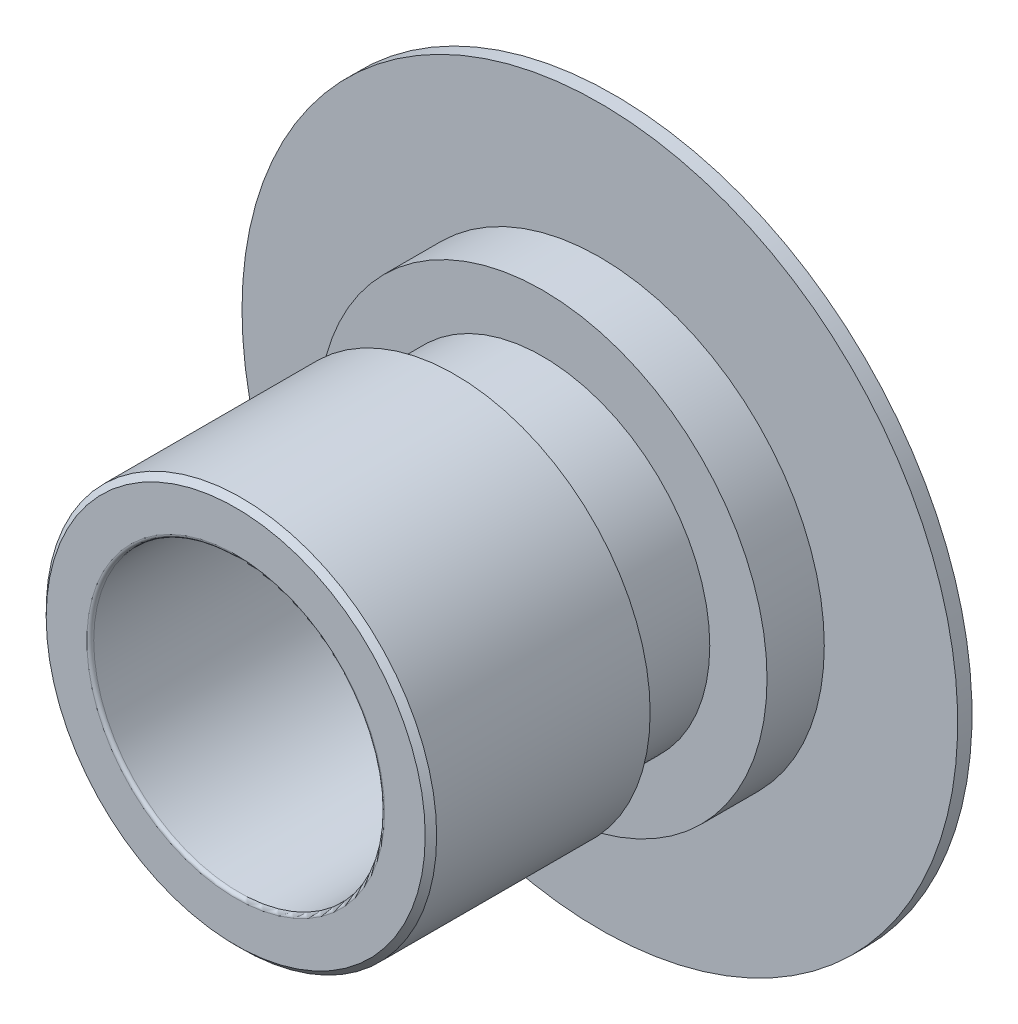
ISO-10303-21;
HEADER;
FILE_DESCRIPTION(('STEP AP214'),'2;1');
FILE_NAME('part.step','',(''),(''),'','','');
FILE_SCHEMA(('AUTOMOTIVE_DESIGN { 1 0 10303 214 1 1 1 1 }'));
ENDSEC;
DATA;
#1=APPLICATION_CONTEXT('core data for automotive mechanical design processes');
#2=APPLICATION_PROTOCOL_DEFINITION('international standard','automotive_design',2000,#1);
#3=PRODUCT_CONTEXT('',#1,'mechanical');
#4=PRODUCT('Part','Part','',(#3));
#5=PRODUCT_RELATED_PRODUCT_CATEGORY('part','',(#4));
#6=PRODUCT_DEFINITION_FORMATION('','',#4);
#7=PRODUCT_DEFINITION_CONTEXT('part definition',#1,'design');
#8=PRODUCT_DEFINITION('design','',#6,#7);
#9=PRODUCT_DEFINITION_SHAPE('','',#8);
#10=(LENGTH_UNIT() NAMED_UNIT(*) SI_UNIT(.MILLI.,.METRE.));
#11=(NAMED_UNIT(*) PLANE_ANGLE_UNIT() SI_UNIT($,.RADIAN.));
#12=(NAMED_UNIT(*) SI_UNIT($,.STERADIAN.) SOLID_ANGLE_UNIT());
#13=UNCERTAINTY_MEASURE_WITH_UNIT(LENGTH_MEASURE(1.E-05),#10,'distance_accuracy_value','');
#14=(GEOMETRIC_REPRESENTATION_CONTEXT(3) GLOBAL_UNCERTAINTY_ASSIGNED_CONTEXT((#13)) GLOBAL_UNIT_ASSIGNED_CONTEXT((#10,
#11,#12)) REPRESENTATION_CONTEXT('',''));
#15=CARTESIAN_POINT('',(0.,0.,0.));
#16=DIRECTION('',(0.,0.,1.));
#17=DIRECTION('',(1.,0.,0.));
#18=AXIS2_PLACEMENT_3D('',#15,#16,#17);
#19=CARTESIAN_POINT('',(0.,0.,6.8072));
#20=DIRECTION('',(0.,0.,1.));
#21=DIRECTION('',(1.,0.,0.));
#22=AXIS2_PLACEMENT_3D('',#19,#20,#21);
#23=PLANE('',#22);
#24=CARTESIAN_POINT('',(0.,0.,6.8072));
#25=DIRECTION('',(0.,0.,1.));
#26=DIRECTION('',(1.,0.,0.));
#27=AXIS2_PLACEMENT_3D('',#24,#25,#26);
#28=CIRCLE('',#27,3.302);
#29=CARTESIAN_POINT('',(3.302,0.,6.8072));
#30=VERTEX_POINT('',#29);
#31=EDGE_CURVE('E10',#30,#30,#28,.F.);
#32=ORIENTED_EDGE('',*,*,#31,.T.);
#33=EDGE_LOOP('',(#32));
#34=FACE_BOUND('',#33,.T.);
#35=CARTESIAN_POINT('',(0.,0.,6.8072));
#36=DIRECTION('',(0.,0.,1.));
#37=DIRECTION('',(1.,0.,0.));
#38=AXIS2_PLACEMENT_3D('',#35,#36,#37);
#39=CIRCLE('',#38,4.2037);
#40=CARTESIAN_POINT('',(4.2037,0.,6.8072));
#41=VERTEX_POINT('',#40);
#42=EDGE_CURVE('E46',#41,#41,#39,.T.);
#43=ORIENTED_EDGE('',*,*,#42,.T.);
#44=EDGE_LOOP('',(#43));
#45=FACE_BOUND('',#44,.T.);
#46=ADVANCED_FACE('F31',(#34,#45),#23,.T.);
#47=CARTESIAN_POINT('',(0.,0.,6.8072));
#48=DIRECTION('',(0.,0.,-1.));
#49=DIRECTION('',(-1.,0.,0.));
#50=AXIS2_PLACEMENT_3D('',#47,#48,#49);
#51=CYLINDRICAL_SURFACE('',#50,4.3307);
#52=CARTESIAN_POINT('',(0.,0.,6.6802));
#53=DIRECTION('',(0.,0.,1.));
#54=DIRECTION('',(1.,0.,0.));
#55=AXIS2_PLACEMENT_3D('',#52,#53,#54);
#56=CIRCLE('',#55,4.3307);
#57=CARTESIAN_POINT('',(4.3307,0.,6.6802));
#58=VERTEX_POINT('',#57);
#59=EDGE_CURVE('E42',#58,#58,#56,.F.);
#60=ORIENTED_EDGE('',*,*,#59,.T.);
#61=EDGE_LOOP('',(#60));
#62=FACE_BOUND('',#61,.T.);
#63=CARTESIAN_POINT('',(0.,0.,1.94474478244989));
#64=DIRECTION('',(0.,0.,1.));
#65=DIRECTION('',(1.,0.,0.));
#66=AXIS2_PLACEMENT_3D('',#63,#64,#65);
#67=CIRCLE('',#66,4.3307);
#68=CARTESIAN_POINT('',(4.3307,0.,1.94474478244989));
#69=VERTEX_POINT('',#68);
#70=EDGE_CURVE('E51',#69,#69,#67,.T.);
#71=ORIENTED_EDGE('',*,*,#70,.T.);
#72=EDGE_LOOP('',(#71));
#73=FACE_BOUND('',#72,.T.);
#74=ADVANCED_FACE('F99',(#62,#73),#51,.T.);
#75=CARTESIAN_POINT('',(0.,0.,6.8072));
#76=DIRECTION('',(0.,0.,-1.));
#77=DIRECTION('',(-1.,0.,0.));
#78=AXIS2_PLACEMENT_3D('',#75,#76,#77);
#79=CYLINDRICAL_SURFACE('',#78,3.2258);
#80=CARTESIAN_POINT('',(0.,0.,6.731));
#81=DIRECTION('',(0.,0.,1.));
#82=DIRECTION('',(1.,0.,0.));
#83=AXIS2_PLACEMENT_3D('',#80,#81,#82);
#84=CIRCLE('',#83,3.2258);
#85=CARTESIAN_POINT('',(3.2258,0.,6.731));
#86=VERTEX_POINT('',#85);
#87=EDGE_CURVE('E38',#86,#86,#84,.T.);
#88=ORIENTED_EDGE('',*,*,#87,.T.);
#89=EDGE_LOOP('',(#88));
#90=FACE_BOUND('',#89,.T.);
#91=CARTESIAN_POINT('',(0.,0.,-1.5875));
#92=DIRECTION('',(0.,0.,-1.));
#93=DIRECTION('',(-1.,0.,0.));
#94=AXIS2_PLACEMENT_3D('',#91,#92,#93);
#95=CIRCLE('',#94,3.2258);
#96=CARTESIAN_POINT('',(-3.2258,0.,-1.5875));
#97=VERTEX_POINT('',#96);
#98=EDGE_CURVE('E64',#97,#97,#95,.T.);
#99=ORIENTED_EDGE('',*,*,#98,.T.);
#100=EDGE_LOOP('',(#99));
#101=FACE_BOUND('',#100,.T.);
#102=ADVANCED_FACE('F89',(#90,#101),#79,.F.);
#103=CARTESIAN_POINT('',(0.,0.,0.));
#104=DIRECTION('',(0.,0.,-1.));
#105=DIRECTION('',(-1.,0.,0.));
#106=AXIS2_PLACEMENT_3D('',#103,#104,#105);
#107=PLANE('',#106);
#108=CARTESIAN_POINT('',(0.,0.,0.));
#109=DIRECTION('',(0.,0.,-1.));
#110=DIRECTION('',(-1.,0.,0.));
#111=AXIS2_PLACEMENT_3D('',#108,#109,#110);
#112=CIRCLE('',#111,4.9784);
#113=CARTESIAN_POINT('',(-4.9784,0.,0.));
#114=VERTEX_POINT('',#113);
#115=EDGE_CURVE('E55',#114,#114,#112,.T.);
#116=ORIENTED_EDGE('',*,*,#115,.F.);
#117=EDGE_LOOP('',(#116));
#118=FACE_BOUND('',#117,.T.);
#119=CARTESIAN_POINT('',(0.,0.,0.));
#120=DIRECTION('',(0.,0.,1.));
#121=DIRECTION('',(1.,0.,0.));
#122=AXIS2_PLACEMENT_3D('',#119,#120,#121);
#123=CIRCLE('',#122,3.7084);
#124=CARTESIAN_POINT('',(3.7084,0.,0.));
#125=VERTEX_POINT('',#124);
#126=EDGE_CURVE('E70',#125,#125,#123,.T.);
#127=ORIENTED_EDGE('',*,*,#126,.F.);
#128=EDGE_LOOP('',(#127));
#129=FACE_BOUND('',#128,.T.);
#130=ADVANCED_FACE('F86',(#118,#129),#107,.F.);
#131=CARTESIAN_POINT('',(0.,0.,-1.27));
#132=DIRECTION('',(0.,0.,1.));
#133=DIRECTION('',(1.,0.,0.));
#134=AXIS2_PLACEMENT_3D('',#131,#132,#133);
#135=CYLINDRICAL_SURFACE('',#134,4.9784);
#136=CARTESIAN_POINT('',(0.,0.,-1.27));
#137=DIRECTION('',(0.,0.,-1.));
#138=DIRECTION('',(-1.,0.,0.));
#139=AXIS2_PLACEMENT_3D('',#136,#137,#138);
#140=CIRCLE('',#139,4.9784);
#141=CARTESIAN_POINT('',(-4.9784,0.,-1.27));
#142=VERTEX_POINT('',#141);
#143=EDGE_CURVE('E54',#142,#142,#140,.T.);
#144=ORIENTED_EDGE('',*,*,#143,.F.);
#145=EDGE_LOOP('',(#144));
#146=FACE_BOUND('',#145,.T.);
#147=ORIENTED_EDGE('',*,*,#115,.T.);
#148=EDGE_LOOP('',(#147));
#149=FACE_BOUND('',#148,.T.);
#150=ADVANCED_FACE('F88',(#146,#149),#135,.T.);
#151=CARTESIAN_POINT('',(0.,0.,-1.27));
#152=DIRECTION('',(0.,0.,-1.));
#153=DIRECTION('',(-1.,0.,0.));
#154=AXIS2_PLACEMENT_3D('',#151,#152,#153);
#155=PLANE('',#154);
#156=CARTESIAN_POINT('',(0.,0.,-1.27));
#157=DIRECTION('',(0.,0.,-1.));
#158=DIRECTION('',(-1.,0.,0.));
#159=AXIS2_PLACEMENT_3D('',#156,#157,#158);
#160=CIRCLE('',#159,7.9375);
#161=CARTESIAN_POINT('',(-7.9375,0.,-1.27));
#162=VERTEX_POINT('',#161);
#163=EDGE_CURVE('E61',#162,#162,#160,.T.);
#164=ORIENTED_EDGE('',*,*,#163,.F.);
#165=EDGE_LOOP('',(#164));
#166=FACE_BOUND('',#165,.T.);
#167=ORIENTED_EDGE('',*,*,#143,.T.);
#168=EDGE_LOOP('',(#167));
#169=FACE_BOUND('',#168,.T.);
#170=ADVANCED_FACE('F96',(#166,#169),#155,.F.);
#171=CARTESIAN_POINT('',(0.,0.,-1.5875));
#172=DIRECTION('',(0.,0.,-1.));
#173=DIRECTION('',(-1.,0.,0.));
#174=AXIS2_PLACEMENT_3D('',#171,#172,#173);
#175=PLANE('',#174);
#176=CARTESIAN_POINT('',(0.,0.,-1.5875));
#177=DIRECTION('',(0.,0.,-1.));
#178=DIRECTION('',(-1.,0.,0.));
#179=AXIS2_PLACEMENT_3D('',#176,#177,#178);
#180=CIRCLE('',#179,7.9375);
#181=CARTESIAN_POINT('',(-7.9375,0.,-1.5875));
#182=VERTEX_POINT('',#181);
#183=EDGE_CURVE('E58',#182,#182,#180,.T.);
#184=ORIENTED_EDGE('',*,*,#183,.T.);
#185=EDGE_LOOP('',(#184));
#186=FACE_BOUND('',#185,.T.);
#187=ORIENTED_EDGE('',*,*,#98,.F.);
#188=EDGE_LOOP('',(#187));
#189=FACE_BOUND('',#188,.T.);
#190=ADVANCED_FACE('F178',(#186,#189),#175,.T.);
#191=CARTESIAN_POINT('',(0.,0.,-1.5875));
#192=DIRECTION('',(0.,0.,1.));
#193=DIRECTION('',(1.,0.,0.));
#194=AXIS2_PLACEMENT_3D('',#191,#192,#193);
#195=CYLINDRICAL_SURFACE('',#194,7.9375);
#196=ORIENTED_EDGE('',*,*,#183,.F.);
#197=EDGE_LOOP('',(#196));
#198=FACE_BOUND('',#197,.T.);
#199=ORIENTED_EDGE('',*,*,#163,.T.);
#200=EDGE_LOOP('',(#199));
#201=FACE_BOUND('',#200,.T.);
#202=ADVANCED_FACE('F82',(#198,#201),#195,.T.);
#203=CARTESIAN_POINT('',(0.,0.,1.778));
#204=DIRECTION('',(0.,0.,-1.));
#205=DIRECTION('',(-1.,0.,0.));
#206=AXIS2_PLACEMENT_3D('',#203,#204,#205);
#207=CYLINDRICAL_SURFACE('',#206,3.7084);
#208=CARTESIAN_POINT('',(0.,0.,1.778));
#209=DIRECTION('',(0.,0.,1.));
#210=DIRECTION('',(1.,0.,0.));
#211=AXIS2_PLACEMENT_3D('',#208,#209,#210);
#212=CIRCLE('',#211,3.7084);
#213=CARTESIAN_POINT('',(3.7084,0.,1.778));
#214=VERTEX_POINT('',#213);
#215=EDGE_CURVE('E69',#214,#214,#212,.T.);
#216=ORIENTED_EDGE('',*,*,#215,.F.);
#217=EDGE_LOOP('',(#216));
#218=FACE_BOUND('',#217,.T.);
#219=ORIENTED_EDGE('',*,*,#126,.T.);
#220=EDGE_LOOP('',(#219));
#221=FACE_BOUND('',#220,.T.);
#222=ADVANCED_FACE('F79',(#218,#221),#207,.T.);
#223=CARTESIAN_POINT('',(0.,0.,1.94474478244989));
#224=DIRECTION('',(0.,0.,1.));
#225=DIRECTION('',(1.,0.,0.));
#226=AXIS2_PLACEMENT_3D('',#223,#224,#225);
#227=CONICAL_SURFACE('',#226,4.3307,1.30899693899575);
#228=ORIENTED_EDGE('',*,*,#215,.T.);
#229=EDGE_LOOP('',(#228));
#230=FACE_BOUND('',#229,.T.);
#231=ORIENTED_EDGE('',*,*,#70,.F.);
#232=EDGE_LOOP('',(#231));
#233=FACE_BOUND('',#232,.T.);
#234=ADVANCED_FACE('F76',(#230,#233),#227,.T.);
#235=CARTESIAN_POINT('',(0.,0.,6.8072));
#236=DIRECTION('',(0.,0.,-1.));
#237=DIRECTION('',(-1.,0.,0.));
#238=AXIS2_PLACEMENT_3D('',#235,#236,#237);
#239=CONICAL_SURFACE('',#238,4.2037,0.785398163397459);
#240=ORIENTED_EDGE('',*,*,#59,.F.);
#241=EDGE_LOOP('',(#240));
#242=FACE_BOUND('',#241,.T.);
#243=ORIENTED_EDGE('',*,*,#42,.F.);
#244=EDGE_LOOP('',(#243));
#245=FACE_BOUND('',#244,.T.);
#246=ADVANCED_FACE('F113',(#242,#245),#239,.T.);
#247=CARTESIAN_POINT('',(0.,0.,6.731));
#248=DIRECTION('',(0.,0.,1.));
#249=DIRECTION('',(1.,0.,0.));
#250=AXIS2_PLACEMENT_3D('',#247,#248,#249);
#251=TOROIDAL_SURFACE('',#250,3.302,0.0762);
#252=ORIENTED_EDGE('',*,*,#31,.F.);
#253=EDGE_LOOP('',(#252));
#254=FACE_BOUND('',#253,.T.);
#255=ORIENTED_EDGE('',*,*,#87,.F.);
#256=EDGE_LOOP('',(#255));
#257=FACE_BOUND('',#256,.T.);
#258=ADVANCED_FACE('F33',(#254,#257),#251,.T.);
#259=CLOSED_SHELL('',(#46,#74,#102,#130,#150,#170,#190,#202,#222,#234,#246,#258));
#260=MANIFOLD_SOLID_BREP('B2',#259);
#261=ADVANCED_BREP_SHAPE_REPRESENTATION('',(#18,#260),#14);
#262=SHAPE_DEFINITION_REPRESENTATION(#9,#261);
ENDSEC;
END-ISO-10303-21;
